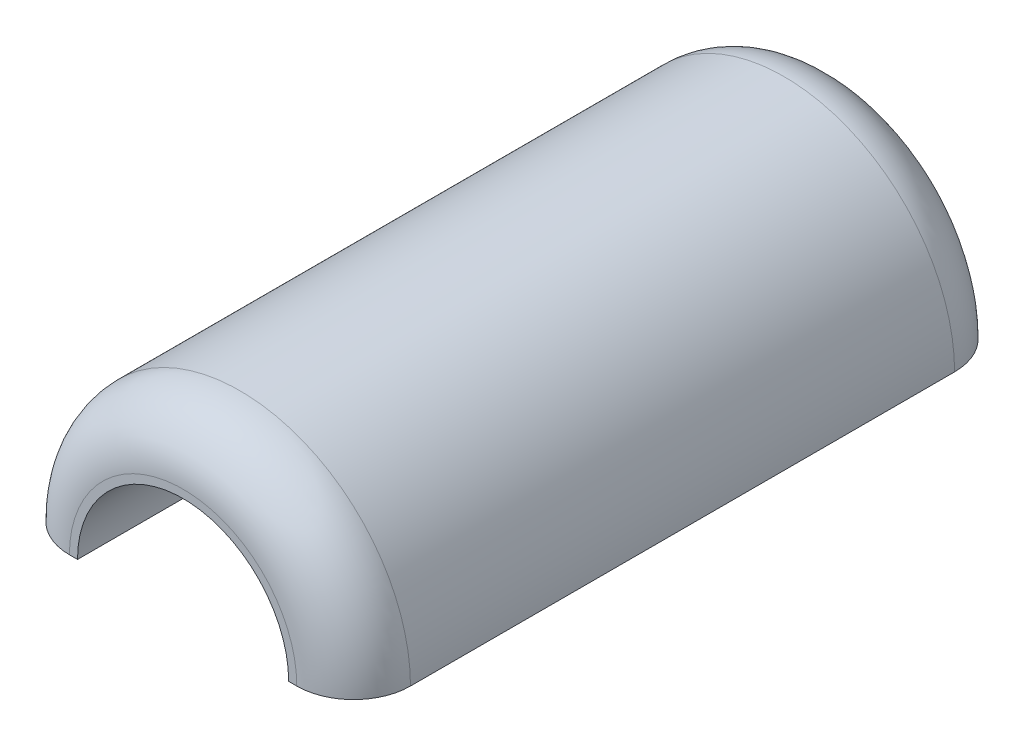
ISO-10303-21;
HEADER;
FILE_DESCRIPTION(('STEP AP214'),'2;1');
FILE_NAME('part.step','',(''),(''),'','','');
FILE_SCHEMA(('AUTOMOTIVE_DESIGN { 1 0 10303 214 1 1 1 1 }'));
ENDSEC;
DATA;
#1=APPLICATION_CONTEXT('core data for automotive mechanical design processes');
#2=APPLICATION_PROTOCOL_DEFINITION('international standard','automotive_design',2000,#1);
#3=PRODUCT_CONTEXT('',#1,'mechanical');
#4=PRODUCT('Part','Part','',(#3));
#5=PRODUCT_RELATED_PRODUCT_CATEGORY('part','',(#4));
#6=PRODUCT_DEFINITION_FORMATION('','',#4);
#7=PRODUCT_DEFINITION_CONTEXT('part definition',#1,'design');
#8=PRODUCT_DEFINITION('design','',#6,#7);
#9=PRODUCT_DEFINITION_SHAPE('','',#8);
#10=(LENGTH_UNIT() NAMED_UNIT(*) SI_UNIT(.MILLI.,.METRE.));
#11=(NAMED_UNIT(*) PLANE_ANGLE_UNIT() SI_UNIT($,.RADIAN.));
#12=(NAMED_UNIT(*) SI_UNIT($,.STERADIAN.) SOLID_ANGLE_UNIT());
#13=UNCERTAINTY_MEASURE_WITH_UNIT(LENGTH_MEASURE(1.E-05),#10,'distance_accuracy_value','');
#14=(GEOMETRIC_REPRESENTATION_CONTEXT(3) GLOBAL_UNCERTAINTY_ASSIGNED_CONTEXT((#13)) GLOBAL_UNIT_ASSIGNED_CONTEXT((#10,
#11,#12)) REPRESENTATION_CONTEXT('',''));
#15=CARTESIAN_POINT('',(0.,0.,0.));
#16=DIRECTION('',(0.,0.,1.));
#17=DIRECTION('',(1.,0.,0.));
#18=AXIS2_PLACEMENT_3D('',#15,#16,#17);
#19=CARTESIAN_POINT('',(0.,0.,40.5));
#20=DIRECTION('',(0.,0.,-1.));
#21=DIRECTION('',(-1.,0.,0.));
#22=AXIS2_PLACEMENT_3D('',#19,#20,#21);
#23=CYLINDRICAL_SURFACE('',#22,10.5);
#24=CARTESIAN_POINT('',(0.,0.,37.));
#25=DIRECTION('',(0.,0.,1.));
#26=DIRECTION('',(1.,0.,0.));
#27=AXIS2_PLACEMENT_3D('',#24,#25,#26);
#28=CIRCLE('',#27,10.5);
#29=CARTESIAN_POINT('',(-10.5,0.,37.));
#30=VERTEX_POINT('',#29);
#31=CARTESIAN_POINT('',(10.5,0.,37.));
#32=VERTEX_POINT('',#31);
#33=EDGE_CURVE('E110',#30,#32,#28,.F.);
#34=ORIENTED_EDGE('',*,*,#33,.T.);
#35=DIRECTION('',(0.,0.,-1.));
#36=VECTOR('',#35,1.);
#37=CARTESIAN_POINT('',(10.5,0.,40.5));
#38=LINE('',#37,#36);
#39=CARTESIAN_POINT('',(10.5,0.,3.5));
#40=VERTEX_POINT('',#39);
#41=EDGE_CURVE('E129',#32,#40,#38,.T.);
#42=ORIENTED_EDGE('',*,*,#41,.T.);
#43=CARTESIAN_POINT('',(0.,0.,3.5));
#44=DIRECTION('',(0.,0.,1.));
#45=DIRECTION('',(1.,0.,0.));
#46=AXIS2_PLACEMENT_3D('',#43,#44,#45);
#47=CIRCLE('',#46,10.5);
#48=CARTESIAN_POINT('',(-10.5,0.,3.5));
#49=VERTEX_POINT('',#48);
#50=EDGE_CURVE('E105',#40,#49,#47,.T.);
#51=ORIENTED_EDGE('',*,*,#50,.T.);
#52=DIRECTION('',(0.,0.,-1.));
#53=VECTOR('',#52,1.);
#54=CARTESIAN_POINT('',(-10.5,0.,40.5));
#55=LINE('',#54,#53);
#56=EDGE_CURVE('E55',#49,#30,#55,.F.);
#57=ORIENTED_EDGE('',*,*,#56,.T.);
#58=EDGE_LOOP('',(#34,#42,#51,#57));
#59=FACE_BOUND('',#58,.T.);
#60=ADVANCED_FACE('F33',(#59),#23,.T.);
#61=CARTESIAN_POINT('',(0.,0.,40.5));
#62=DIRECTION('',(0.,0.,1.));
#63=DIRECTION('',(1.,0.,0.));
#64=AXIS2_PLACEMENT_3D('',#61,#62,#63);
#65=PLANE('',#64);
#66=DIRECTION('',(-1.,0.,0.));
#67=VECTOR('',#66,1.);
#68=CARTESIAN_POINT('',(0.,0.,40.5));
#69=LINE('',#68,#67);
#70=CARTESIAN_POINT('',(7.,0.,40.5));
#71=VERTEX_POINT('',#70);
#72=CARTESIAN_POINT('',(6.5,0.,40.5));
#73=VERTEX_POINT('',#72);
#74=EDGE_CURVE('E137',#71,#73,#69,.T.);
#75=ORIENTED_EDGE('',*,*,#74,.F.);
#76=CARTESIAN_POINT('',(0.,0.,40.5));
#77=DIRECTION('',(0.,0.,1.));
#78=DIRECTION('',(1.,0.,0.));
#79=AXIS2_PLACEMENT_3D('',#76,#77,#78);
#80=CIRCLE('',#79,7.);
#81=CARTESIAN_POINT('',(-7.,0.,40.5));
#82=VERTEX_POINT('',#81);
#83=EDGE_CURVE('E113',#71,#82,#80,.T.);
#84=ORIENTED_EDGE('',*,*,#83,.T.);
#85=CARTESIAN_POINT('',(-6.5,0.,40.5));
#86=VERTEX_POINT('',#85);
#87=EDGE_CURVE('E132',#86,#82,#69,.T.);
#88=ORIENTED_EDGE('',*,*,#87,.F.);
#89=CARTESIAN_POINT('',(0.,0.,40.5));
#90=DIRECTION('',(0.,0.,1.));
#91=DIRECTION('',(1.,0.,0.));
#92=AXIS2_PLACEMENT_3D('',#89,#90,#91);
#93=CIRCLE('',#92,6.5);
#94=EDGE_CURVE('E116',#73,#86,#93,.T.);
#95=ORIENTED_EDGE('',*,*,#94,.F.);
#96=EDGE_LOOP('',(#75,#84,#88,#95));
#97=FACE_BOUND('',#96,.T.);
#98=ADVANCED_FACE('F150',(#97),#65,.T.);
#99=CARTESIAN_POINT('',(0.,0.,0.));
#100=DIRECTION('',(0.,0.,1.));
#101=DIRECTION('',(1.,0.,0.));
#102=AXIS2_PLACEMENT_3D('',#99,#100,#101);
#103=PLANE('',#102);
#104=CARTESIAN_POINT('',(0.,0.,0.));
#105=DIRECTION('',(0.,0.,1.));
#106=DIRECTION('',(1.,0.,0.));
#107=AXIS2_PLACEMENT_3D('',#104,#105,#106);
#108=CIRCLE('',#107,7.);
#109=CARTESIAN_POINT('',(-7.,0.,0.));
#110=VERTEX_POINT('',#109);
#111=CARTESIAN_POINT('',(7.,0.,0.));
#112=VERTEX_POINT('',#111);
#113=EDGE_CURVE('E101',#110,#112,#108,.F.);
#114=ORIENTED_EDGE('',*,*,#113,.T.);
#115=DIRECTION('',(-1.,0.,0.));
#116=VECTOR('',#115,1.);
#117=CARTESIAN_POINT('',(0.,0.,0.));
#118=LINE('',#117,#116);
#119=EDGE_CURVE('E122',#112,#110,#118,.T.);
#120=ORIENTED_EDGE('',*,*,#119,.T.);
#121=EDGE_LOOP('',(#114,#120));
#122=FACE_BOUND('',#121,.T.);
#123=ADVANCED_FACE('F154',(#122),#103,.F.);
#124=CARTESIAN_POINT('',(0.,0.,40.5));
#125=DIRECTION('',(0.,0.,-1.));
#126=DIRECTION('',(-1.,0.,0.));
#127=AXIS2_PLACEMENT_3D('',#124,#125,#126);
#128=CYLINDRICAL_SURFACE('',#127,6.5);
#129=DIRECTION('',(0.,0.,-1.));
#130=VECTOR('',#129,1.);
#131=CARTESIAN_POINT('',(6.5,0.,40.5));
#132=LINE('',#131,#130);
#133=CARTESIAN_POINT('',(6.5,0.,5.));
#134=VERTEX_POINT('',#133);
#135=EDGE_CURVE('E48',#73,#134,#132,.T.);
#136=ORIENTED_EDGE('',*,*,#135,.F.);
#137=ORIENTED_EDGE('',*,*,#94,.T.);
#138=DIRECTION('',(0.,0.,-1.));
#139=VECTOR('',#138,1.);
#140=CARTESIAN_POINT('',(-6.5,0.,40.5));
#141=LINE('',#140,#139);
#142=CARTESIAN_POINT('',(-6.5,0.,5.));
#143=VERTEX_POINT('',#142);
#144=EDGE_CURVE('E133',#143,#86,#141,.F.);
#145=ORIENTED_EDGE('',*,*,#144,.F.);
#146=CARTESIAN_POINT('',(0.,0.,5.));
#147=DIRECTION('',(0.,0.,1.));
#148=DIRECTION('',(1.,0.,0.));
#149=AXIS2_PLACEMENT_3D('',#146,#147,#148);
#150=CIRCLE('',#149,6.5);
#151=EDGE_CURVE('E95',#143,#134,#150,.F.);
#152=ORIENTED_EDGE('',*,*,#151,.T.);
#153=EDGE_LOOP('',(#136,#137,#145,#152));
#154=FACE_BOUND('',#153,.T.);
#155=ADVANCED_FACE('F152',(#154),#128,.F.);
#156=CARTESIAN_POINT('',(0.,0.,4.));
#157=DIRECTION('',(0.,0.,1.));
#158=DIRECTION('',(1.,0.,0.));
#159=AXIS2_PLACEMENT_3D('',#156,#157,#158);
#160=PLANE('',#159);
#161=DIRECTION('',(-1.,0.,0.));
#162=VECTOR('',#161,1.);
#163=CARTESIAN_POINT('',(0.,0.,4.));
#164=LINE('',#163,#162);
#165=CARTESIAN_POINT('',(5.5,0.,4.));
#166=VERTEX_POINT('',#165);
#167=CARTESIAN_POINT('',(-5.5,0.,4.));
#168=VERTEX_POINT('',#167);
#169=EDGE_CURVE('E90',#166,#168,#164,.T.);
#170=ORIENTED_EDGE('',*,*,#169,.F.);
#171=CARTESIAN_POINT('',(0.,0.,4.));
#172=DIRECTION('',(0.,0.,1.));
#173=DIRECTION('',(1.,0.,0.));
#174=AXIS2_PLACEMENT_3D('',#171,#172,#173);
#175=CIRCLE('',#174,5.5);
#176=EDGE_CURVE('E99',#166,#168,#175,.T.);
#177=ORIENTED_EDGE('',*,*,#176,.T.);
#178=EDGE_LOOP('',(#170,#177));
#179=FACE_BOUND('',#178,.T.);
#180=ADVANCED_FACE('F98',(#179),#160,.T.);
#181=CARTESIAN_POINT('',(0.,0.,37.));
#182=DIRECTION('',(0.,0.,1.));
#183=DIRECTION('',(1.,0.,0.));
#184=AXIS2_PLACEMENT_3D('',#181,#182,#183);
#185=TOROIDAL_SURFACE('',#184,7.,3.5);
#186=CARTESIAN_POINT('',(-7.,0.,37.));
#187=DIRECTION('',(0.,1.,0.));
#188=DIRECTION('',(0.,0.,1.));
#189=AXIS2_PLACEMENT_3D('',#186,#187,#188);
#190=CIRCLE('',#189,3.5);
#191=EDGE_CURVE('E125',#82,#30,#190,.F.);
#192=ORIENTED_EDGE('',*,*,#191,.F.);
#193=ORIENTED_EDGE('',*,*,#83,.F.);
#194=CARTESIAN_POINT('',(7.,0.,37.));
#195=DIRECTION('',(0.,1.,0.));
#196=DIRECTION('',(0.,0.,1.));
#197=AXIS2_PLACEMENT_3D('',#194,#195,#196);
#198=CIRCLE('',#197,3.5);
#199=EDGE_CURVE('E135',#32,#71,#198,.F.);
#200=ORIENTED_EDGE('',*,*,#199,.F.);
#201=ORIENTED_EDGE('',*,*,#33,.F.);
#202=EDGE_LOOP('',(#192,#193,#200,#201));
#203=FACE_BOUND('',#202,.T.);
#204=ADVANCED_FACE('F148',(#203),#185,.T.);
#205=CARTESIAN_POINT('',(0.,0.,3.5));
#206=DIRECTION('',(0.,0.,1.));
#207=DIRECTION('',(1.,0.,0.));
#208=AXIS2_PLACEMENT_3D('',#205,#206,#207);
#209=TOROIDAL_SURFACE('',#208,7.,3.5);
#210=CARTESIAN_POINT('',(-7.,0.,3.5));
#211=DIRECTION('',(0.,1.,0.));
#212=DIRECTION('',(0.,0.,1.));
#213=AXIS2_PLACEMENT_3D('',#210,#211,#212);
#214=CIRCLE('',#213,3.5);
#215=EDGE_CURVE('E119',#49,#110,#214,.F.);
#216=ORIENTED_EDGE('',*,*,#215,.F.);
#217=ORIENTED_EDGE('',*,*,#50,.F.);
#218=CARTESIAN_POINT('',(7.,0.,3.5));
#219=DIRECTION('',(0.,1.,0.));
#220=DIRECTION('',(0.,0.,1.));
#221=AXIS2_PLACEMENT_3D('',#218,#219,#220);
#222=CIRCLE('',#221,3.5);
#223=EDGE_CURVE('E127',#112,#40,#222,.F.);
#224=ORIENTED_EDGE('',*,*,#223,.F.);
#225=ORIENTED_EDGE('',*,*,#113,.F.);
#226=EDGE_LOOP('',(#216,#217,#224,#225));
#227=FACE_BOUND('',#226,.T.);
#228=ADVANCED_FACE('F173',(#227),#209,.T.);
#229=CARTESIAN_POINT('',(0.,0.,5.));
#230=DIRECTION('',(0.,0.,1.));
#231=DIRECTION('',(1.,0.,0.));
#232=AXIS2_PLACEMENT_3D('',#229,#230,#231);
#233=TOROIDAL_SURFACE('',#232,5.5,1.);
#234=ORIENTED_EDGE('',*,*,#151,.F.);
#235=CARTESIAN_POINT('',(-5.5,0.,5.));
#236=DIRECTION('',(0.,1.,0.));
#237=DIRECTION('',(0.,0.,1.));
#238=AXIS2_PLACEMENT_3D('',#235,#236,#237);
#239=CIRCLE('',#238,1.);
#240=EDGE_CURVE('E11',#143,#168,#239,.F.);
#241=ORIENTED_EDGE('',*,*,#240,.T.);
#242=ORIENTED_EDGE('',*,*,#176,.F.);
#243=CARTESIAN_POINT('',(5.5,0.,5.));
#244=DIRECTION('',(0.,1.,0.));
#245=DIRECTION('',(0.,0.,1.));
#246=AXIS2_PLACEMENT_3D('',#243,#244,#245);
#247=CIRCLE('',#246,1.);
#248=EDGE_CURVE('E41',#166,#134,#247,.F.);
#249=ORIENTED_EDGE('',*,*,#248,.T.);
#250=EDGE_LOOP('',(#234,#241,#242,#249));
#251=FACE_BOUND('',#250,.T.);
#252=ADVANCED_FACE('F35',(#251),#233,.F.);
#253=CARTESIAN_POINT('',(0.,0.,0.));
#254=DIRECTION('',(0.,1.,0.));
#255=DIRECTION('',(0.,0.,1.));
#256=AXIS2_PLACEMENT_3D('',#253,#254,#255);
#257=PLANE('',#256);
#258=ORIENTED_EDGE('',*,*,#215,.T.);
#259=ORIENTED_EDGE('',*,*,#119,.F.);
#260=ORIENTED_EDGE('',*,*,#223,.T.);
#261=ORIENTED_EDGE('',*,*,#41,.F.);
#262=ORIENTED_EDGE('',*,*,#199,.T.);
#263=ORIENTED_EDGE('',*,*,#74,.T.);
#264=ORIENTED_EDGE('',*,*,#135,.T.);
#265=ORIENTED_EDGE('',*,*,#248,.F.);
#266=ORIENTED_EDGE('',*,*,#169,.T.);
#267=ORIENTED_EDGE('',*,*,#240,.F.);
#268=ORIENTED_EDGE('',*,*,#144,.T.);
#269=ORIENTED_EDGE('',*,*,#87,.T.);
#270=ORIENTED_EDGE('',*,*,#191,.T.);
#271=ORIENTED_EDGE('',*,*,#56,.F.);
#272=EDGE_LOOP('',(#258,#259,#260,#261,#262,#263,#264,#265,#266,#267,#268,#269,#270,#271));
#273=FACE_BOUND('',#272,.T.);
#274=ADVANCED_FACE('F89',(#273),#257,.F.);
#275=CLOSED_SHELL('',(#60,#98,#123,#155,#180,#204,#228,#252,#274));
#276=MANIFOLD_SOLID_BREP('B2',#275);
#277=ADVANCED_BREP_SHAPE_REPRESENTATION('',(#18,#276),#14);
#278=SHAPE_DEFINITION_REPRESENTATION(#9,#277);
ENDSEC;
END-ISO-10303-21;
